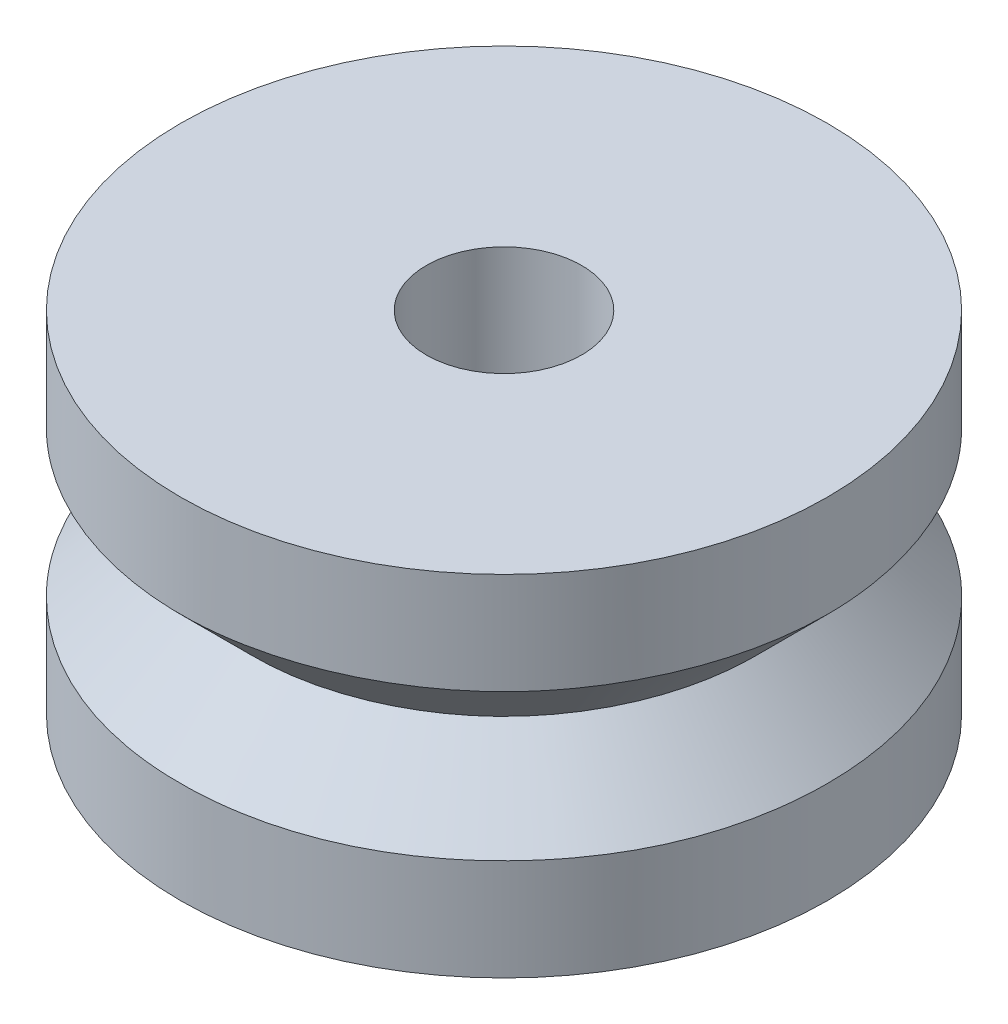
ISO-10303-21;
HEADER;
FILE_DESCRIPTION(('STEP AP214'),'2;1');
FILE_NAME('part.step','',(''),(''),'','','');
FILE_SCHEMA(('AUTOMOTIVE_DESIGN { 1 0 10303 214 1 1 1 1 }'));
ENDSEC;
DATA;
#1=APPLICATION_CONTEXT('core data for automotive mechanical design processes');
#2=APPLICATION_PROTOCOL_DEFINITION('international standard','automotive_design',2000,#1);
#3=PRODUCT_CONTEXT('',#1,'mechanical');
#4=PRODUCT('Part','Part','',(#3));
#5=PRODUCT_RELATED_PRODUCT_CATEGORY('part','',(#4));
#6=PRODUCT_DEFINITION_FORMATION('','',#4);
#7=PRODUCT_DEFINITION_CONTEXT('part definition',#1,'design');
#8=PRODUCT_DEFINITION('design','',#6,#7);
#9=PRODUCT_DEFINITION_SHAPE('','',#8);
#10=(LENGTH_UNIT() NAMED_UNIT(*) SI_UNIT(.MILLI.,.METRE.));
#11=(NAMED_UNIT(*) PLANE_ANGLE_UNIT() SI_UNIT($,.RADIAN.));
#12=(NAMED_UNIT(*) SI_UNIT($,.STERADIAN.) SOLID_ANGLE_UNIT());
#13=UNCERTAINTY_MEASURE_WITH_UNIT(LENGTH_MEASURE(1.E-05),#10,'distance_accuracy_value','');
#14=(GEOMETRIC_REPRESENTATION_CONTEXT(3) GLOBAL_UNCERTAINTY_ASSIGNED_CONTEXT((#13)) GLOBAL_UNIT_ASSIGNED_CONTEXT((#10,
#11,#12)) REPRESENTATION_CONTEXT('',''));
#15=CARTESIAN_POINT('',(0.,0.,0.));
#16=DIRECTION('',(0.,0.,1.));
#17=DIRECTION('',(1.,0.,0.));
#18=AXIS2_PLACEMENT_3D('',#15,#16,#17);
#19=CARTESIAN_POINT('',(0.,27.,0.));
#20=DIRECTION('',(0.,-1.,0.));
#21=DIRECTION('',(0.,0.,-1.));
#22=AXIS2_PLACEMENT_3D('',#19,#20,#21);
#23=CYLINDRICAL_SURFACE('',#22,25.);
#24=CARTESIAN_POINT('',(0.,19.1568542494923,-25.));
#25=CARTESIAN_POINT('',(-0.702130936899535,19.1568558298434,-25.0000052318776));
#26=CARTESIAN_POINT('',(-1.40417675735937,19.1585366600255,-24.970408594473));
#27=CARTESIAN_POINT('',(-2.80351111614704,19.1634063966516,-24.8522304637799));
#28=CARTESIAN_POINT('',(-3.50079834898091,19.1665957012991,-24.763633393173));
#29=CARTESIAN_POINT('',(-4.88618950804165,19.1729508827939,-24.527932167098));
#30=CARTESIAN_POINT('',(-5.57428251708218,19.1761167300916,-24.3807639143283));
#31=CARTESIAN_POINT('',(-6.93558198670023,19.1813176312341,-24.0289798373366));
#32=CARTESIAN_POINT('',(-7.60878945210543,19.1833527616315,-23.8243679036194));
#33=CARTESIAN_POINT('',(-8.93544454583427,19.1856827814592,-23.3591919603295));
#34=CARTESIAN_POINT('',(-9.5888959196252,19.1859780028354,-23.0986386332821));
#35=CARTESIAN_POINT('',(-10.8715385047305,19.1847452764228,-22.5234023465561));
#36=CARTESIAN_POINT('',(-11.5007293215352,19.1832172989991,-22.2087185070958));
#37=CARTESIAN_POINT('',(-12.7301945499593,19.1787846558158,-21.5275630945139));
#38=CARTESIAN_POINT('',(-13.3304761022131,19.1758803319572,-21.1611043987479));
#39=CARTESIAN_POINT('',(-14.4980858787534,19.1696456892872,-20.3788900412173));
#40=CARTESIAN_POINT('',(-15.0654142009996,19.1663153717423,-19.963134526008));
#41=CARTESIAN_POINT('',(-15.9800386060179,19.1615868679069,-19.2316931257921));
#42=CARTESIAN_POINT('',(-16.3376652545329,19.1599146313715,-18.9288200378123));
#43=CARTESIAN_POINT('',(-17.0353616485912,19.1575300222402,-18.3034384932402));
#44=CARTESIAN_POINT('',(-17.3754313639243,19.1568176512958,-17.9809300028636));
#45=CARTESIAN_POINT('',(-18.0369046671961,19.1568945557472,-17.3173200503456));
#46=CARTESIAN_POINT('',(-18.3583083165613,19.157683826201,-16.9762186493973));
#47=CARTESIAN_POINT('',(-18.9814536716341,19.1601812543355,-16.2764831154992));
#48=CARTESIAN_POINT('',(-19.2831946182794,19.1618894474668,-15.9178483066211));
#49=CARTESIAN_POINT('',(-19.8660478004041,19.1657241403355,-15.1841905018426));
#50=CARTESIAN_POINT('',(-20.1471599418195,19.16785064198,-14.8091674312268));
#51=CARTESIAN_POINT('',(-20.6878671754749,19.1720883584971,-14.0439183713327));
#52=CARTESIAN_POINT('',(-20.9474622973083,19.1741995733906,-13.6536924029649));
#53=CARTESIAN_POINT('',(-21.4442681577824,19.1780602454262,-12.8593456921132));
#54=CARTESIAN_POINT('',(-21.6814832125813,19.1798097724003,-12.4552276494125));
#55=CARTESIAN_POINT('',(-22.1328366060485,19.1826956403363,-11.6343007567399));
#56=CARTESIAN_POINT('',(-22.3469749134445,19.1838319804671,-11.2174918895711));
#57=CARTESIAN_POINT('',(-22.751496709561,19.1853399629109,-10.3725024890519));
#58=CARTESIAN_POINT('',(-22.9418802852454,19.1857116080233,-9.94432199733883));
#59=CARTESIAN_POINT('',(-23.2982911434518,19.185642354345,-9.07794249048438));
#60=CARTESIAN_POINT('',(-23.4643184784391,19.1852014573046,-8.63974349692592));
#61=CARTESIAN_POINT('',(-23.7714931315187,19.1835639611319,-7.75470988062175));
#62=CARTESIAN_POINT('',(-23.9126403586523,19.1823673592368,-7.30787522631173));
#63=CARTESIAN_POINT('',(-24.1696081552761,19.1793788556313,-6.40698451941083));
#64=CARTESIAN_POINT('',(-24.2854287574615,19.1775869546895,-5.95292847614315));
#65=CARTESIAN_POINT('',(-24.4913814238209,19.1736677954683,-5.03901350602556));
#66=CARTESIAN_POINT('',(-24.5815126642969,19.1715405264392,-4.5791543936009));
#67=CARTESIAN_POINT('',(-24.7357974990449,19.1673056416917,-3.65509835044105));
#68=CARTESIAN_POINT('',(-24.7999510657076,19.1651980259942,-3.19090141509611));
#69=CARTESIAN_POINT('',(-24.9020774437959,19.1614379082691,-2.25963636025577));
#70=CARTESIAN_POINT('',(-24.9400503883044,19.1597854039281,-1.79256825536743));
#71=CARTESIAN_POINT('',(-24.9896961959099,19.1574592852656,-0.857036627730774));
#72=CARTESIAN_POINT('',(-25.001369126997,19.1567856684135,-0.388573108592973));
#73=CARTESIAN_POINT('',(-24.9983758129561,19.1569373104829,0.548278898940192));
#74=CARTESIAN_POINT('',(-24.9837094632362,19.1577625753563,1.01666738703023));
#75=CARTESIAN_POINT('',(-24.9280918290322,19.1603141628195,1.95184937408818));
#76=CARTESIAN_POINT('',(-24.8871405598949,19.1620404848832,2.4186428739872));
#77=CARTESIAN_POINT('',(-24.7520482039908,19.1668571479147,3.581822761621));
#78=CARTESIAN_POINT('',(-24.6415535755315,19.1701980226594,4.27637591340514));
#79=CARTESIAN_POINT('',(-24.3624731866152,19.1763853477404,5.65364730381188));
#80=CARTESIAN_POINT('',(-24.1938875001582,19.1792317987064,6.3363655575093));
#81=CARTESIAN_POINT('',(-23.7998172027115,19.1835097840753,7.68520029279412));
#82=CARTESIAN_POINT('',(-23.5743326723729,19.1849413204838,8.35131679791212));
#83=CARTESIAN_POINT('',(-23.0680679669268,19.1859731329541,9.66219098383459));
#84=CARTESIAN_POINT('',(-22.7872878095908,19.1855734096045,10.3069486715035));
#85=CARTESIAN_POINT('',(-22.1723801283811,19.1830553878471,11.5706256665591));
#86=CARTESIAN_POINT('',(-21.8382442171646,19.1809368190287,12.1895408922709));
#87=CARTESIAN_POINT('',(-21.1190319582919,19.1756210824199,13.3970263566897));
#88=CARTESIAN_POINT('',(-20.7339554726304,19.1724239117073,13.9855965131817));
#89=CARTESIAN_POINT('',(-19.9155977996832,19.166068302344,15.1282115297615));
#90=CARTESIAN_POINT('',(-19.4823166392302,19.1629098636717,15.6822564090671));
#91=CARTESIAN_POINT('',(-18.570625614026,19.1582311464673,16.7518858775789));
#92=CARTESIAN_POINT('',(-18.0922159970221,19.1567108589427,17.2674706778964));
#93=CARTESIAN_POINT('',(-17.0936420126751,19.1570299772069,18.2565408653281));
#94=CARTESIAN_POINT('',(-16.5734752280618,19.1588695776297,18.7300238118699));
#95=CARTESIAN_POINT('',(-15.4951105759597,19.1639315667974,19.6314908158159));
#96=CARTESIAN_POINT('',(-14.9369124984009,19.1671539631809,20.0594746218674));
#97=CARTESIAN_POINT('',(-13.7864495088369,19.1735024507687,20.8669040965236));
#98=CARTESIAN_POINT('',(-13.194184578419,19.1766285419209,21.2463497388939));
#99=CARTESIAN_POINT('',(-11.9797951398327,19.1816996927513,21.954006106227));
#100=CARTESIAN_POINT('',(-11.3576707097267,19.1836447555169,22.2822169651246));
#101=CARTESIAN_POINT('',(-10.0879730420891,19.1857772452721,22.8850761137244));
#102=CARTESIAN_POINT('',(-9.44039931431775,19.1859646383864,23.1597233710015));
#103=CARTESIAN_POINT('',(-8.12441553387602,19.1845280451052,23.6534935591417));
#104=CARTESIAN_POINT('',(-7.45600546736482,19.1829040575065,23.8726164531211));
#105=CARTESIAN_POINT('',(-6.1031235274806,19.1783199778218,24.2537798476821));
#106=CARTESIAN_POINT('',(-5.41865161113402,19.1753598821606,24.4158201955207));
#107=CARTESIAN_POINT('',(-4.03842798473107,19.169085089993,24.6816710389335));
#108=CARTESIAN_POINT('',(-3.34267626761516,19.1657703932646,24.7854814980627));
#109=CARTESIAN_POINT('',(-2.17800767593247,19.1611395967072,24.909354663742));
#110=CARTESIAN_POINT('',(-1.71076711678537,19.1595255816862,24.9457976984101));
#111=CARTESIAN_POINT('',(-0.774944759071819,19.1573206620782,24.9923764419218));
#112=CARTESIAN_POINT('',(-0.306362959360324,19.156729758365,25.0025121282995));
#113=CARTESIAN_POINT('',(0.630620135761195,19.1570379771635,24.9964364334794));
#114=CARTESIAN_POINT('',(1.09902143175179,19.157937094842,24.9802251377433));
#115=CARTESIAN_POINT('',(2.03417236817765,19.1605974070019,24.9215092671107));
#116=CARTESIAN_POINT('',(2.50092200791712,19.1623586018463,24.879004681139));
#117=CARTESIAN_POINT('',(3.43129543063835,19.1662615144755,24.7678360669059));
#118=CARTESIAN_POINT('',(3.89491919976815,19.1684032339454,24.6991719227987));
#119=CARTESIAN_POINT('',(4.81757574043222,19.1726370723427,24.5359012661081));
#120=CARTESIAN_POINT('',(5.2766085186185,19.174729191342,24.4412947911189));
#121=CARTESIAN_POINT('',(6.18855300602679,19.1785262370562,24.2264570700544));
#122=CARTESIAN_POINT('',(6.64146579377985,19.1802312328536,24.1062304033671));
#123=CARTESIAN_POINT('',(7.53982426113186,19.1830108107928,23.8405214405115));
#124=CARTESIAN_POINT('',(7.98526992965819,19.184085392,23.6950391068964));
#125=CARTESIAN_POINT('',(8.86728396525262,19.185461580626,23.3792790211353));
#126=CARTESIAN_POINT('',(9.30385236487175,19.1857631908798,23.209001359927));
#127=CARTESIAN_POINT('',(10.1667331670792,19.1855546483281,22.8441885300576));
#128=CARTESIAN_POINT('',(10.5930455714541,19.185044495664,22.6496533656221));
#129=CARTESIAN_POINT('',(11.4340682961068,19.1832782932321,22.2369398963477));
#130=CARTESIAN_POINT('',(11.8487785740013,19.1820222407399,22.0187615051527));
#131=CARTESIAN_POINT('',(12.665284677822,19.1789335927925,21.5594521214477));
#132=CARTESIAN_POINT('',(13.0670805185512,19.1771009979983,21.3183211552479));
#133=CARTESIAN_POINT('',(13.8564999218995,19.1731272191845,20.8138615115297));
#134=CARTESIAN_POINT('',(14.2441231213978,19.1709860272653,20.550532265834));
#135=CARTESIAN_POINT('',(15.0039636458253,19.1667593727911,20.0025122617599));
#136=CARTESIAN_POINT('',(15.3761809564507,19.164673910288,19.7178214835488));
#137=CARTESIAN_POINT('',(16.1040332911254,19.1609951593696,19.1279776577579));
#138=CARTESIAN_POINT('',(16.4596684044326,19.1594018683048,18.8228247203426));
#139=CARTESIAN_POINT('',(17.1532338745745,19.1572585645608,18.1930205406034));
#140=CARTESIAN_POINT('',(17.4911642373769,19.1567085515299,17.8683693048518));
#141=CARTESIAN_POINT('',(18.1482567591414,19.157091282614,17.2005866395837));
#142=CARTESIAN_POINT('',(18.4674188366248,19.1580240331656,16.8574551298513));
#143=CARTESIAN_POINT('',(19.0859440466952,19.1607352837202,16.1538298520094));
#144=CARTESIAN_POINT('',(19.3853071883164,19.1625137833372,15.7933360918224));
#145=CARTESIAN_POINT('',(20.107791035728,19.1674127803141,14.8717880691857));
#146=CARTESIAN_POINT('',(20.5180021362102,19.1707597817943,14.3005292818486));
#147=CARTESIAN_POINT('',(21.2888207301776,19.1768915759813,13.1255452060919));
#148=CARTESIAN_POINT('',(21.6494282992965,19.1796763695454,12.5218199671779));
#149=CARTESIAN_POINT('',(22.3185319769279,19.1837932456432,11.2861297376845));
#150=CARTESIAN_POINT('',(22.6270282678407,19.1851253332616,10.6541648459596));
#151=CARTESIAN_POINT('',(23.1897021385593,19.1859500537558,9.3665048448186));
#152=CARTESIAN_POINT('',(23.4438797310248,19.1854426870603,8.71080974093316));
#153=CARTESIAN_POINT('',(23.8961477525531,19.1827329470022,7.38023739262931));
#154=CARTESIAN_POINT('',(24.0942296132203,19.1805303148855,6.70535723507685));
#155=CARTESIAN_POINT('',(24.4328461784877,19.1750957821719,5.34134003456028));
#156=CARTESIAN_POINT('',(24.5733807292463,19.1718638788233,4.65220295348826));
#157=CARTESIAN_POINT('',(24.7959085272619,19.1655289323013,3.26444269392426));
#158=CARTESIAN_POINT('',(24.8779016895295,19.1624258893148,2.56581950166201));
#159=CARTESIAN_POINT('',(24.9565444483194,19.1590444096267,1.514755674359));
#160=CARTESIAN_POINT('',(24.9753671715977,19.1581294002675,1.16384121573307));
#161=CARTESIAN_POINT('',(24.9982082641402,19.1569784075809,0.461507414153267));
#162=CARTESIAN_POINT('',(25.0022266442262,19.1567424237572,0.110088071568655));
#163=CARTESIAN_POINT('',(24.9954448724815,19.1570962920954,-0.592626057396861));
#164=CARTESIAN_POINT('',(24.9846439224262,19.1576861887424,-0.943920836048783));
#165=CARTESIAN_POINT('',(24.9482486693202,19.1594103666108,-1.64571956779044));
#166=CARTESIAN_POINT('',(24.9226543542101,19.1605446482759,-1.99622352023528));
#167=CARTESIAN_POINT('',(24.8237310412446,19.1644441918608,-3.04562819700515));
#168=CARTESIAN_POINT('',(24.7282601780289,19.1677064295227,-3.74257507062783));
#169=CARTESIAN_POINT('',(24.4789639838937,19.1740490902536,-5.125857162815));
#170=CARTESIAN_POINT('',(24.3251385190408,19.1771295129052,-5.81219235702015));
#171=CARTESIAN_POINT('',(23.9602193078996,19.1820649398664,-7.16949549644349));
#172=CARTESIAN_POINT('',(23.7491257101292,19.1839199473538,-7.84046348150976));
#173=CARTESIAN_POINT('',(23.2711589126226,19.1858540717077,-9.16226671105518));
#174=CARTESIAN_POINT('',(23.0042825280906,19.1859330871498,-9.81310080359736));
#175=CARTESIAN_POINT('',(22.4166516678555,19.1842931874558,-11.0899787964872));
#176=CARTESIAN_POINT('',(22.0958971396851,19.1825742705688,-11.7160226726931));
#177=CARTESIAN_POINT('',(21.4028196523086,19.177842889204,-12.938827508288));
#178=CARTESIAN_POINT('',(21.0304985243772,19.1748304706542,-13.5355895065399));
#179=CARTESIAN_POINT('',(20.2368691229302,19.1685245135727,-14.6956762720638));
#180=CARTESIAN_POINT('',(19.8155608832318,19.1652309752352,-15.2590010624181));
#181=CARTESIAN_POINT('',(19.075220363553,19.160707146391,-16.1664957235994));
#182=CARTESIAN_POINT('',(18.7689072042868,19.1591550546298,-16.5211263959535));
#183=CARTESIAN_POINT('',(18.1368207744852,19.1571390121258,-17.2126436625002));
#184=CARTESIAN_POINT('',(17.8110474633831,19.1566750636513,-17.5495302197009));
#185=CARTESIAN_POINT('',(17.141092150129,19.1572125161508,-18.2044616754375));
#186=CARTESIAN_POINT('',(16.796910125207,19.1582139189372,-18.522506550667));
#187=CARTESIAN_POINT('',(16.0911344996777,19.161026462597,-19.1388333188363));
#188=CARTESIAN_POINT('',(15.729536521817,19.1628378079957,-19.4371101981393));
#189=CARTESIAN_POINT('',(14.9901441730438,19.1668026584202,-20.0128735535152));
#190=CARTESIAN_POINT('',(14.6123498046838,19.1689561633922,-20.2903600328648));
#191=CARTESIAN_POINT('',(13.841796834177,19.1731817621296,-20.823646571357));
#192=CARTESIAN_POINT('',(13.449038504406,19.1752538573755,-21.0794470249581));
#193=CARTESIAN_POINT('',(12.4497615144597,19.1799121805151,-21.6909508250407));
#194=CARTESIAN_POINT('',(11.8345810141121,19.1822372007864,-22.0326304735487));
#195=CARTESIAN_POINT('',(10.5776312158809,19.185223823765,-22.6629257147292));
#196=CARTESIAN_POINT('',(9.93586021430764,19.18588531972,-22.9515379008347));
#197=CARTESIAN_POINT('',(8.63096921936534,19.1853586144404,-23.4733783145198));
#198=CARTESIAN_POINT('',(7.96787337256021,19.1841724378245,-23.7066668412845));
#199=CARTESIAN_POINT('',(6.62462581635192,19.1802993228938,-24.1165384818533));
#200=CARTESIAN_POINT('',(5.94447856884996,19.1776127733517,-24.2931362665528));
#201=CARTESIAN_POINT('',(4.39492853396474,19.1707987548876,-24.6264832020432));
#202=CARTESIAN_POINT('',(3.52186142553552,19.1664783946862,-24.7664317795229));
#203=CARTESIAN_POINT('',(1.76581797342588,19.1595051545625,-24.9531865473901));
#204=CARTESIAN_POINT('',(0.882841702540565,19.1568522623989,-24.9999934215693));
#205=CARTESIAN_POINT('',(0.,19.1568542494923,-25.));
#206=B_SPLINE_CURVE_WITH_KNOTS('',3,(#24,#25,#26,#27,#28,#29,#30,#31,#32,#33,#34,#35,#36,#37,
#38,#39,#40,#41,#42,#43,#44,#45,#46,#47,#48,#49,#50,#51,#52,#53,#54,#55,#56,#57,#58,#59,#60,#61,
#62,#63,#64,#65,#66,#67,#68,#69,#70,#71,#72,#73,#74,#75,#76,#77,#78,#79,#80,#81,#82,#83,#84,#85,
#86,#87,#88,#89,#90,#91,#92,#93,#94,#95,#96,#97,#98,#99,#100,#101,#102,#103,#104,#105,#106,#107,
#108,#109,#110,#111,#112,#113,#114,#115,#116,#117,#118,#119,#120,#121,#122,#123,#124,#125,#126,
#127,#128,#129,#130,#131,#132,#133,#134,#135,#136,#137,#138,#139,#140,#141,#142,#143,#144,#145,
#146,#147,#148,#149,#150,#151,#152,#153,#154,#155,#156,#157,#158,#159,#160,#161,#162,#163,#164,
#165,#166,#167,#168,#169,#170,#171,#172,#173,#174,#175,#176,#177,#178,#179,#180,#181,#182,#183,
#184,#185,#186,#187,#188,#189,#190,#191,#192,#193,#194,#195,#196,#197,#198,#199,#200,#201,#202,
#203,#204,#205),.UNSPECIFIED.,.T.,.F.,(4,2,2,2,2,2,2,2,2,2,2,2,2,2,2,2,2,2,2,2,2,2,2,2,2,2,2,2,
2,2,2,2,2,2,2,2,2,2,2,2,2,2,2,2,2,2,2,2,2,2,2,2,2,2,2,2,2,2,2,2,2,2,2,2,2,2,2,2,2,2,2,2,2,2,2,2,
2,2,2,2,2,2,2,2,2,2,2,2,2,2,4),(0.,2.10562351142162,4.21180317093632,6.32029409143729,
8.42864224400092,10.5365881455447,12.6445683107145,14.7520251025497,16.8594756292475,
18.264748774605,19.670024337927,21.0752952764912,22.4806204322709,23.8859519957067,
25.2912816262881,26.6963396724372,28.1013996226138,29.5064544288499,30.9115062084466,
32.3165631246371,33.7216182269718,35.1267183756198,36.5318200176212,37.9369145170749,
39.3420053841088,40.7471018306919,42.1521974568867,44.2594337375869,46.3666673339742,
48.4738979434908,50.581127875765,52.6886893840903,54.7962566022196,56.9038226471987,
59.0113771226827,61.119053689961,63.2267419001603,65.3344312495403,67.4421150890402,
69.5498395496113,71.657565410301,73.7652969108629,75.8730297306125,77.2783434302095,
78.6836583299167,80.0889686712127,81.4942796044527,82.8995967610911,84.3049118812376,
85.7099760238203,87.1150422497208,88.5201033226176,89.9251641507619,91.330230111025,
92.7352944607001,94.1403947846961,95.5454964132497,96.9505904776072,98.3556840683505,
99.7607837585635,101.165882807634,103.273111907741,105.380337794783,107.48755630594,
109.594774325986,111.702314041651,113.809859391376,115.917407800793,116.97141134128,
118.025414111294,119.079473656083,120.133534060129,122.241196320999,124.348863419332,
126.456525051742,128.564307049344,130.672091099541,132.779800315587,134.887508076629,
136.29265743381,137.697809720263,139.102963744807,140.50847279688,141.913981627438,
143.319464886963,145.427915382134,147.536501178148,149.642778080276,151.748509462536,
154.39608670971,157.043644519855),.UNSPECIFIED.);
#207=CARTESIAN_POINT('',(0.,19.1568542494923,-25.));
#208=VERTEX_POINT('',#207);
#209=EDGE_CURVE('E74',#208,#208,#206,.T.);
#210=ORIENTED_EDGE('',*,*,#209,.T.);
#211=EDGE_LOOP('',(#210));
#212=FACE_BOUND('',#211,.T.);
#213=CARTESIAN_POINT('',(0.,27.,0.));
#214=DIRECTION('',(0.,1.,0.));
#215=DIRECTION('',(0.,0.,1.));
#216=AXIS2_PLACEMENT_3D('',#213,#214,#215);
#217=CIRCLE('',#216,25.);
#218=CARTESIAN_POINT('',(0.,27.,25.));
#219=VERTEX_POINT('',#218);
#220=EDGE_CURVE('E82',#219,#219,#217,.T.);
#221=ORIENTED_EDGE('',*,*,#220,.F.);
#222=EDGE_LOOP('',(#221));
#223=FACE_BOUND('',#222,.T.);
#224=ADVANCED_FACE('F69',(#212,#223),#23,.T.);
#225=CARTESIAN_POINT('',(0.,7.84314575050757,-25.));
#226=CARTESIAN_POINT('',(0.70213039242485,7.84314417022639,-25.0000052319263));
#227=CARTESIAN_POINT('',(1.40417566775638,7.84146334273437,-24.9704086404435));
#228=CARTESIAN_POINT('',(2.80350894705962,7.83659361243468,-24.8522306930166));
#229=CARTESIAN_POINT('',(3.50079564554777,7.8334043114259,-24.7636337598649));
#230=CARTESIAN_POINT('',(4.88618575633086,7.82704913504825,-24.5279328987521));
#231=CARTESIAN_POINT('',(5.574278251494,7.82388328922656,-24.3807648737592));
#232=CARTESIAN_POINT('',(6.93557672837632,7.81868238715779,-24.0289813390383));
#233=CARTESIAN_POINT('',(7.60878371490755,7.8166472543594,-23.8243697197575));
#234=CARTESIAN_POINT('',(8.93543841232743,7.81431722496384,-23.3591943064796));
#235=CARTESIAN_POINT('',(9.58888985342093,7.81402199777339,-23.0986411514867));
#236=CARTESIAN_POINT('',(10.8715325876239,7.81525471310678,-22.5234052025885));
#237=CARTESIAN_POINT('',(11.5007234862121,7.81678268526632,-22.2087215288749));
#238=CARTESIAN_POINT('',(12.7301888937464,7.82121532006032,-21.5275664393127));
#239=CARTESIAN_POINT('',(13.3304705432386,7.82411964079732,-21.1611079006684));
#240=CARTESIAN_POINT('',(14.4980805270108,7.83035428100966,-20.3788938486256));
#241=CARTESIAN_POINT('',(15.065408959254,7.83368459921851,-19.9631384817878));
#242=CARTESIAN_POINT('',(15.9800335570096,7.83841310797721,-19.2316973211209));
#243=CARTESIAN_POINT('',(16.3376602849614,7.84008534749999,-18.9288243270983));
#244=CARTESIAN_POINT('',(17.0353568430645,7.84246996590683,-18.3034429658329));
#245=CARTESIAN_POINT('',(17.3754266430051,7.8431823431393,-17.9809345648051));
#246=CARTESIAN_POINT('',(18.036900120393,7.84310545100749,-17.3173247860777));
#247=CARTESIAN_POINT('',(18.358303859267,7.84231618658515,-16.9762234695712));
#248=CARTESIAN_POINT('',(18.9814493977777,7.83981876735569,-16.2764880996115));
#249=CARTESIAN_POINT('',(19.2831904383644,7.83811057709829,-15.9178533702404));
#250=CARTESIAN_POINT('',(19.8660438127054,7.83427588796742,-15.1841957190864));
#251=CARTESIAN_POINT('',(20.1471560523954,7.83214938718669,-14.809172722588));
#252=CARTESIAN_POINT('',(20.6878634866234,7.82791167053679,-14.0439238053062));
#253=CARTESIAN_POINT('',(20.9474587107545,7.82580045464661,-13.653697905433));
#254=CARTESIAN_POINT('',(21.4442647796237,7.82193977923945,-12.8593513255296));
#255=CARTESIAN_POINT('',(21.681479940509,7.82019024989091,-12.4552333452771));
#256=CARTESIAN_POINT('',(22.1328335494969,7.81730437626981,-11.6343065714481));
#257=CARTESIAN_POINT('',(22.3469719663274,7.81616803282819,-11.217497760675));
#258=CARTESIAN_POINT('',(22.7514939843185,7.81466004330872,-10.3725084667081));
#259=CARTESIAN_POINT('',(22.9418776724428,7.81428839443133,-9.94432802515187));
#260=CARTESIAN_POINT('',(23.2982887581908,7.8143576406124,-9.07794861218334));
#261=CARTESIAN_POINT('',(23.464316208278,7.8147985339206,-8.6397496623534));
#262=CARTESIAN_POINT('',(23.7714910938395,7.81643602314797,-7.75471612696811));
#263=CARTESIAN_POINT('',(23.9126384383552,7.81763262182983,-7.30788150984842));
#264=CARTESIAN_POINT('',(24.1696064716512,7.82062112000923,-6.40699087067957));
#265=CARTESIAN_POINT('',(24.2854271931269,7.82241301873826,-5.95293485795367));
#266=CARTESIAN_POINT('',(24.4913800996226,7.82633217496711,-5.0390199420899));
#267=CARTESIAN_POINT('',(24.5815114609396,7.82845944321681,-4.57916085337596));
#268=CARTESIAN_POINT('',(24.7357965385121,7.83269432833497,-3.65510485081692));
#269=CARTESIAN_POINT('',(24.7999502271579,7.83480194518255,-3.19090793236202));
#270=CARTESIAN_POINT('',(24.9020768499711,7.83856206721314,-2.25964290442185));
#271=CARTESIAN_POINT('',(24.9400499172209,7.84021457470954,-1.79257480954363));
#272=CARTESIAN_POINT('',(24.9896959706797,7.84254070308045,-0.857043195013012));
#273=CARTESIAN_POINT('',(25.0013690248787,7.84321432648554,-0.38857967897116));
#274=CARTESIAN_POINT('',(24.9983759570436,7.84306269701028,0.548272329306632));
#275=CARTESIAN_POINT('',(24.9837097304182,7.84223743817798,1.01666082123727));
#276=CARTESIAN_POINT('',(24.9280923419853,7.83968585970316,1.95184282288032));
#277=CARTESIAN_POINT('',(24.8871411955249,7.83795954058673,2.41863633352383));
#278=CARTESIAN_POINT('',(24.7520491452916,7.83314288233017,3.58181625683012));
#279=CARTESIAN_POINT('',(24.6415546993275,7.82980200811798,4.27636943783302));
#280=CARTESIAN_POINT('',(24.3624746722647,7.82361468037769,5.65364090192937));
#281=CARTESIAN_POINT('',(24.1938891651651,7.82076822621981,6.33635920009746));
#282=CARTESIAN_POINT('',(23.7998192220435,7.81649023235974,7.68519403926383));
#283=CARTESIAN_POINT('',(23.5743348666729,7.815058690652,8.35131060379281));
#284=CARTESIAN_POINT('',(23.0680705055185,7.81402686708851,9.66218492306599));
#285=CARTESIAN_POINT('',(22.7872905175064,7.81442658464419,10.3069426846747));
#286=CARTESIAN_POINT('',(22.1723831680462,7.81694459592918,11.5706198417767));
#287=CARTESIAN_POINT('',(21.8382474192412,7.81906316006977,12.1895351555907));
#288=CARTESIAN_POINT('',(21.1190354771697,7.82437889020802,13.3970208095591));
#289=CARTESIAN_POINT('',(20.7339591458976,7.82757605912782,13.9855910674982));
#290=CARTESIAN_POINT('',(19.9156017726196,7.83393166858292,15.128206299588));
#291=CARTESIAN_POINT('',(19.4823207574456,7.83709010913977,15.6822512929561));
#292=CARTESIAN_POINT('',(18.5706300126659,7.84176883743483,16.7518810013957));
#293=CARTESIAN_POINT('',(18.0922205308076,7.8432891341656,17.2674659275785));
#294=CARTESIAN_POINT('',(17.0936468055787,7.84297003318514,18.2565363777353));
#295=CARTESIAN_POINT('',(16.5734801449339,7.8411304408396,18.7300194611342));
#296=CARTESIAN_POINT('',(15.4951157287894,7.83606846121212,19.6314867487092));
#297=CARTESIAN_POINT('',(14.9369177632196,7.83284606629161,20.0594707015325));
#298=CARTESIAN_POINT('',(13.7864549848669,7.82649757795134,20.8669004786063));
#299=CARTESIAN_POINT('',(13.1941901536712,7.82337148458363,21.2463462766221));
#300=CARTESIAN_POINT('',(11.9798009000544,7.81830032666033,21.954002963019));
#301=CARTESIAN_POINT('',(11.3576765556959,7.81635525901733,22.2822139853349));
#302=CARTESIAN_POINT('',(10.0879790461486,7.8142227585702,22.8850734670627));
#303=CARTESIAN_POINT('',(9.44040539074728,7.81403535963951,23.1597208941077));
#304=CARTESIAN_POINT('',(8.12442174048658,7.81547194197474,23.6534914273069));
#305=CARTESIAN_POINT('',(7.45601173178645,7.81709592444391,23.8726144965775));
#306=CARTESIAN_POINT('',(6.10312989255995,7.82167999614132,24.2537782459888));
#307=CARTESIAN_POINT('',(5.41865801906003,7.82464008894472,24.4158187733862));
#308=CARTESIAN_POINT('',(4.03843446308548,7.83091487932572,24.6816699789317));
#309=CARTESIAN_POINT('',(3.34268277355113,7.83422957712528,24.7854806206337));
#310=CARTESIAN_POINT('',(2.17801421495796,7.83886037931985,24.9093540919818));
#311=CARTESIAN_POINT('',(1.71077366561228,7.84047439762325,24.9457972492904));
#312=CARTESIAN_POINT('',(0.774951320597594,7.84267932728015,24.9923762384617));
#313=CARTESIAN_POINT('',(0.306369523783535,7.84327023775994,25.0025120478588));
#314=CARTESIAN_POINT('',(-0.630613572475471,7.84296203150768,24.9964365990553));
#315=CARTESIAN_POINT('',(-1.09901487250097,7.84206291960882,24.9802254263168));
#316=CARTESIAN_POINT('',(-2.03416582389888,7.8394026160552,24.9215098012705));
#317=CARTESIAN_POINT('',(-2.5009154745755,7.83764142403732,24.8790053378875));
#318=CARTESIAN_POINT('',(-3.4312889260442,7.83373851501022,24.7678369680366));
#319=CARTESIAN_POINT('',(-3.89491271298428,7.83159679631588,24.6991729457224));
#320=CARTESIAN_POINT('',(-4.81756929608187,7.82736295763811,24.5359025314384));
#321=CARTESIAN_POINT('',(-5.27660209889132,7.82527083758281,24.4412961770625));
#322=CARTESIAN_POINT('',(-6.18854664236209,7.82147378839218,24.2264586956237));
#323=CARTESIAN_POINT('',(-6.64145946155215,7.81976879017457,24.1062321479444));
#324=CARTESIAN_POINT('',(-7.5398179984148,7.81698920647757,23.84052342116));
#325=CARTESIAN_POINT('',(-7.98526370501482,7.8159146219329,23.6950412046084));
#326=CARTESIAN_POINT('',(-8.86727782328136,7.81453842619575,23.3792813506559));
#327=CARTESIAN_POINT('',(-9.30384626749887,7.81423681216846,23.2090038041928));
#328=CARTESIAN_POINT('',(-10.1667271652849,7.81444534722492,22.8441912011331));
#329=CARTESIAN_POINT('',(-10.59303962064,7.81495549616726,22.6496561487622));
#330=CARTESIAN_POINT('',(-11.4340624534764,7.81672169169296,22.2369429005807));
#331=CARTESIAN_POINT('',(-11.8487727885744,7.81797774100078,22.0187646184139));
#332=CARTESIAN_POINT('',(-12.6652790128374,7.82106638359832,21.5594554493873));
#333=CARTESIAN_POINT('',(-13.0670749168055,7.82289897622716,21.3183245888379));
#334=CARTESIAN_POINT('',(-13.856494452567,7.82687275215835,20.8138651526498));
#335=CARTESIAN_POINT('',(-14.2441177212363,7.82901394336053,20.5505360088284));
#336=CARTESIAN_POINT('',(-15.0039583896167,7.83324059835322,20.002516204461));
#337=CARTESIAN_POINT('',(-15.376175775024,7.835326062092,19.7178255240821));
#338=CARTESIAN_POINT('',(-16.1040282646422,7.8390048174697,19.1279818896019));
#339=CARTESIAN_POINT('',(-16.4596634581108,7.84059811175809,18.8228290456646));
#340=CARTESIAN_POINT('',(-17.1532290937039,7.84274142546769,18.1930250482306));
#341=CARTESIAN_POINT('',(-17.4911595417962,7.84329144524055,17.8683739013062));
#342=CARTESIAN_POINT('',(-18.1482522390079,7.84290872643283,17.2005914087526));
#343=CARTESIAN_POINT('',(-18.467414406649,7.84197598141565,16.8574599829079));
#344=CARTESIAN_POINT('',(-19.0859398015957,7.83926473906564,16.1538348676436));
#345=CARTESIAN_POINT('',(-19.3853030379354,7.83748624211871,15.7933411861465));
#346=CARTESIAN_POINT('',(-20.1077871276104,7.83258724923207,14.871793353265));
#347=CARTESIAN_POINT('',(-20.5179983783034,7.82924024788077,14.3005346735947));
#348=CARTESIAN_POINT('',(-21.2888172811985,7.82310845038102,13.1255508001293));
#349=CARTESIAN_POINT('',(-21.6494250090337,7.82032365337535,12.5218256558395));
#350=CARTESIAN_POINT('',(-22.3185290114979,7.81620676842619,11.2861356018854));
#351=CARTESIAN_POINT('',(-22.627025468527,7.81487467539786,10.6541707910755));
#352=CARTESIAN_POINT('',(-23.1896996776928,7.81404994372678,9.36651093747053));
#353=CARTESIAN_POINT('',(-23.4438774424892,7.81455730465533,8.71081590020616));
#354=CARTESIAN_POINT('',(-23.896145813752,7.81726703448574,7.38024367021927));
#355=CARTESIAN_POINT('',(-24.0942278518091,7.81946966214233,6.70536356435556));
#356=CARTESIAN_POINT('',(-24.4328447755409,7.82490418878969,5.3413464520908));
#357=CARTESIAN_POINT('',(-24.5733795073739,7.82813609053197,4.65220940758174));
#358=CARTESIAN_POINT('',(-24.7959076699695,7.83447103826761,3.26444920577739));
#359=CARTESIAN_POINT('',(-24.8779010157423,7.83757408407388,2.56582603471173));
#360=CARTESIAN_POINT('',(-24.9565440505694,7.84095557179288,1.51476222756221));
#361=CARTESIAN_POINT('',(-24.9753668660002,7.84187058446311,1.16384777371454));
#362=CARTESIAN_POINT('',(-24.9982081429661,7.8430215857941,0.461513977798983));
#363=CARTESIAN_POINT('',(-25.0022266153233,7.84325757495122,0.110094636100351));
#364=CARTESIAN_POINT('',(-24.995445028073,7.84290371625706,-0.592619495041212));
#365=CARTESIAN_POINT('',(-24.9846441702388,7.84231382392057,-0.943914276755353));
#366=CARTESIAN_POINT('',(-24.9482491013483,7.84058965311486,-1.64571301850558));
#367=CARTESIAN_POINT('',(-24.9226548782325,7.83945537420186,-1.99621697789677));
#368=CARTESIAN_POINT('',(-24.8237318406681,7.83555583694523,-3.04562168131237));
#369=CARTESIAN_POINT('',(-24.728261160318,7.8322936009333,-3.74256858043931));
#370=CARTESIAN_POINT('',(-24.4789653290599,7.82595093947099,-5.12585073891703));
#371=CARTESIAN_POINT('',(-24.3251400442183,7.82287051443791,-5.8121859739085));
#372=CARTESIAN_POINT('',(-23.9602211889992,7.81793508019655,-7.16948920990883));
#373=CARTESIAN_POINT('',(-23.7491277671398,7.81608006781035,-7.84045725076577));
#374=CARTESIAN_POINT('',(-23.2711613163556,7.81414593273562,-9.16226060580847));
#375=CARTESIAN_POINT('',(-23.0042851026943,7.81406691146948,-9.81309476807962));
#376=CARTESIAN_POINT('',(-22.4166545777383,7.81570680025255,-11.0899729145942));
#377=CARTESIAN_POINT('',(-22.0959002139768,7.81742571205259,-11.7160168746961));
#378=CARTESIAN_POINT('',(-21.4028230477446,7.82215708555149,-12.9388218916977));
#379=CARTESIAN_POINT('',(-21.0305020765442,7.82516950132248,-13.5355839874572));
#380=CARTESIAN_POINT('',(-20.236872979821,7.83147545681643,-14.6956709608707));
#381=CARTESIAN_POINT('',(-19.8155648881144,7.83476899634533,-15.2589958616064));
#382=CARTESIAN_POINT('',(-19.0752246068317,7.83929283102768,-16.1664907168537));
#383=CARTESIAN_POINT('',(-18.7689115406995,7.84084492615147,-16.5211214695469));
#384=CARTESIAN_POINT('',(-18.1368252925154,7.8428609789198,-17.2126389018855));
#385=CARTESIAN_POINT('',(-17.8110520698972,7.84332493429594,-17.5495255445391));
#386=CARTESIAN_POINT('',(-17.1410969286639,7.84278749398222,-18.2044571760257));
#387=CARTESIAN_POINT('',(-16.7969149872793,7.84178609647985,-18.5225021415527));
#388=CARTESIAN_POINT('',(-16.0911395238631,7.83897356065373,-19.1388290947004));
#389=CARTESIAN_POINT('',(-15.7295416245876,7.83716221780454,-19.4371060686978));
#390=CARTESIAN_POINT('',(-14.9901494275482,7.83319737042897,-20.0128696177502));
#391=CARTESIAN_POINT('',(-14.6123551323365,7.83104386595651,-20.2903561960813));
#392=CARTESIAN_POINT('',(-13.841802302446,7.82681826645534,-20.8236429365062));
#393=CARTESIAN_POINT('',(-13.4490440401425,7.82474616994623,-21.0794434930575));
#394=CARTESIAN_POINT('',(-12.4497672121074,7.82008784201232,-21.6909475547726));
#395=CARTESIAN_POINT('',(-11.8345868025637,7.81776281738957,-22.0326273643053));
#396=CARTESIAN_POINT('',(-10.5776371721881,7.81477618431504,-22.6629229346598));
#397=CARTESIAN_POINT('',(-9.93586624766947,7.81411468261524,-22.9515352889226));
#398=CARTESIAN_POINT('',(-8.63097539053984,7.81464137668229,-23.4733760454402));
#399=CARTESIAN_POINT('',(-7.96787960445035,7.81582754783507,-23.7066647467278));
#400=CARTESIAN_POINT('',(-6.62463215464142,7.81970065371926,-24.1165367408155));
#401=CARTESIAN_POINT('',(-5.94448495281784,7.8223871996783,-24.2931347044799));
#402=CARTESIAN_POINT('',(-4.39493393401234,7.82920121874392,-24.6264822775252));
#403=CARTESIAN_POINT('',(-3.52186576657984,7.8335215854568,-24.7664312012985));
#404=CARTESIAN_POINT('',(-1.76582016091633,7.84049483872123,-24.9531864313047));
#405=CARTESIAN_POINT('',(-0.882842795498154,7.84314773751719,-24.9999934214948));
#406=CARTESIAN_POINT('',(0.,7.84314575050757,-25.));
#407=B_SPLINE_CURVE_WITH_KNOTS('',3,(#225,#226,#227,#228,#229,#230,#231,#232,#233,#234,#235,
#236,#237,#238,#239,#240,#241,#242,#243,#244,#245,#246,#247,#248,#249,#250,#251,#252,#253,#254,
#255,#256,#257,#258,#259,#260,#261,#262,#263,#264,#265,#266,#267,#268,#269,#270,#271,#272,#273,
#274,#275,#276,#277,#278,#279,#280,#281,#282,#283,#284,#285,#286,#287,#288,#289,#290,#291,#292,
#293,#294,#295,#296,#297,#298,#299,#300,#301,#302,#303,#304,#305,#306,#307,#308,#309,#310,#311,
#312,#313,#314,#315,#316,#317,#318,#319,#320,#321,#322,#323,#324,#325,#326,#327,#328,#329,#330,
#331,#332,#333,#334,#335,#336,#337,#338,#339,#340,#341,#342,#343,#344,#345,#346,#347,#348,#349,
#350,#351,#352,#353,#354,#355,#356,#357,#358,#359,#360,#361,#362,#363,#364,#365,#366,#367,#368,
#369,#370,#371,#372,#373,#374,#375,#376,#377,#378,#379,#380,#381,#382,#383,#384,#385,#386,#387,
#388,#389,#390,#391,#392,#393,#394,#395,#396,#397,#398,#399,#400,#401,#402,#403,#404,#405,#406),
.UNSPECIFIED.,.T.,.F.,(4,2,2,2,2,2,2,2,2,2,2,2,2,2,2,2,2,2,2,2,2,2,2,2,2,2,2,2,2,2,2,2,2,2,2,2,
2,2,2,2,2,2,2,2,2,2,2,2,2,2,2,2,2,2,2,2,2,2,2,2,2,2,2,2,2,2,2,2,2,2,2,2,2,2,2,2,2,2,2,2,2,2,2,2,
2,2,2,2,2,2,4),(0.,2.1056218783055,4.2117999011791,6.32028917705189,8.42863568699165,
10.5365815845825,12.6445617468312,14.7520185419637,16.8594690717301,18.2647422168146,
19.670017779894,21.0752887181991,22.4806138728697,23.8859454352099,25.2912750647036,
26.6963331104257,28.1013930601669,29.5064478659687,30.9114996452216,32.3165565610682,
33.7216116630477,35.1267118116077,36.5318134535313,37.9369079529307,39.3419988199131,
40.7470952664167,42.1521908925218,44.2594271737626,46.3666607707201,48.4738913807912,
50.5811213136095,52.6886828229949,54.7962500421872,56.9038160882602,59.0113705648342,
61.1190471333713,63.2267353448366,65.334424695497,67.4421085362737,69.5498329958361,
71.6575588555041,73.7652903550415,75.8730231738009,77.2783368727332,78.6836517717622,
80.0889621123534,81.4942730448828,82.8995902008357,84.3049053203073,85.7099694624722,
87.1150356879436,88.5200967604115,89.9251575881149,91.3302235479375,92.7352878971613,
94.1403882210565,95.5454898495191,96.9505839138077,98.3556775044775,99.7607771945892,
101.16587624355,103.273105344132,105.380331231676,107.487549743338,109.594767763878,
111.702307480577,113.80985283134,115.917401241811,116.97140478282,118.025407553354,
119.079467098797,120.133527503498,122.241189765686,124.348856865342,126.45651849907,
128.564300495743,130.672084544996,132.779793760299,134.887501520638,136.292650877621,
137.697803163856,139.102957188145,140.508466239093,141.913975068563,143.319458327061,
145.427908818693,147.536494610863,149.642771514727,151.748502899843,154.396083429013,
157.04364451647),.UNSPECIFIED.);
#408=CARTESIAN_POINT('',(0.,7.84314575050757,-25.));
#409=VERTEX_POINT('',#408);
#410=EDGE_CURVE('E95',#409,#409,#407,.T.);
#411=ORIENTED_EDGE('',*,*,#410,.T.);
#412=EDGE_LOOP('',(#411));
#413=FACE_BOUND('',#412,.T.);
#414=CARTESIAN_POINT('',(0.,0.,0.));
#415=DIRECTION('',(0.,1.,0.));
#416=DIRECTION('',(0.,0.,1.));
#417=AXIS2_PLACEMENT_3D('',#414,#415,#416);
#418=CIRCLE('',#417,25.);
#419=CARTESIAN_POINT('',(0.,0.,25.));
#420=VERTEX_POINT('',#419);
#421=EDGE_CURVE('E91',#420,#420,#418,.T.);
#422=ORIENTED_EDGE('',*,*,#421,.T.);
#423=EDGE_LOOP('',(#422));
#424=FACE_BOUND('',#423,.T.);
#425=ADVANCED_FACE('F71',(#413,#424),#23,.T.);
#426=CARTESIAN_POINT('',(0.,27.,0.));
#427=DIRECTION('',(0.,-1.,0.));
#428=DIRECTION('',(0.,0.,-1.));
#429=AXIS2_PLACEMENT_3D('',#426,#427,#428);
#430=CYLINDRICAL_SURFACE('',#429,6.);
#431=CARTESIAN_POINT('',(0.,27.,0.));
#432=DIRECTION('',(0.,1.,0.));
#433=DIRECTION('',(0.,0.,1.));
#434=AXIS2_PLACEMENT_3D('',#431,#432,#433);
#435=CIRCLE('',#434,6.);
#436=CARTESIAN_POINT('',(0.,27.,6.));
#437=VERTEX_POINT('',#436);
#438=EDGE_CURVE('E12',#437,#437,#435,.T.);
#439=ORIENTED_EDGE('',*,*,#438,.T.);
#440=EDGE_LOOP('',(#439));
#441=FACE_BOUND('',#440,.T.);
#442=CARTESIAN_POINT('',(0.,0.,0.));
#443=DIRECTION('',(0.,1.,0.));
#444=DIRECTION('',(0.,0.,1.));
#445=AXIS2_PLACEMENT_3D('',#442,#443,#444);
#446=CIRCLE('',#445,6.);
#447=CARTESIAN_POINT('',(0.,0.,6.));
#448=VERTEX_POINT('',#447);
#449=EDGE_CURVE('E87',#448,#448,#446,.T.);
#450=ORIENTED_EDGE('',*,*,#449,.F.);
#451=EDGE_LOOP('',(#450));
#452=FACE_BOUND('',#451,.T.);
#453=ADVANCED_FACE('F122',(#441,#452),#430,.F.);
#454=CARTESIAN_POINT('',(0.,27.,0.));
#455=DIRECTION('',(0.,1.,0.));
#456=DIRECTION('',(0.,0.,1.));
#457=AXIS2_PLACEMENT_3D('',#454,#455,#456);
#458=PLANE('',#457);
#459=ORIENTED_EDGE('',*,*,#220,.T.);
#460=EDGE_LOOP('',(#459));
#461=FACE_BOUND('',#460,.T.);
#462=ORIENTED_EDGE('',*,*,#438,.F.);
#463=EDGE_LOOP('',(#462));
#464=FACE_BOUND('',#463,.T.);
#465=ADVANCED_FACE('F113',(#461,#464),#458,.T.);
#466=CARTESIAN_POINT('',(0.,0.,0.));
#467=DIRECTION('',(0.,1.,0.));
#468=DIRECTION('',(0.,0.,1.));
#469=AXIS2_PLACEMENT_3D('',#466,#467,#468);
#470=PLANE('',#469);
#471=ORIENTED_EDGE('',*,*,#421,.F.);
#472=EDGE_LOOP('',(#471));
#473=FACE_BOUND('',#472,.T.);
#474=ORIENTED_EDGE('',*,*,#449,.T.);
#475=EDGE_LOOP('',(#474));
#476=FACE_BOUND('',#475,.T.);
#477=ADVANCED_FACE('F121',(#473,#476),#470,.F.);
#478=CARTESIAN_POINT('',(19.3431457505076,13.5,0.));
#479=CARTESIAN_POINT('',(19.3431457504839,13.5,-5.05250462477782));
#480=CARTESIAN_POINT('',(15.1575138711927,13.5,-15.1575138727426));
#481=CARTESIAN_POINT('',(-6.31849900092213E-09,13.5,-21.4359616922363));
#482=CARTESIAN_POINT('',(-15.1575138784191,13.5,-15.1575138655323));
#483=CARTESIAN_POINT('',(-21.4359616901007,13.5,1.18873864033287E-08));
#484=CARTESIAN_POINT('',(-15.1575138648495,13.5,15.1575138794559));
#485=CARTESIAN_POINT('',(5.84034925456278E-09,13.5,21.4359616862392));
#486=CARTESIAN_POINT('',(15.1575138715072,13.5,15.1575138727945));
#487=CARTESIAN_POINT('',(19.3431457505312,13.5,5.05250462456957));
#488=CARTESIAN_POINT('',(19.3431457505076,13.5,0.));
#489=CARTESIAN_POINT('',(25.3232753066816,19.4801295561739,0.));
#490=CARTESIAN_POINT('',(25.3232753066507,19.4801295561739,-6.61453763786965));
#491=CARTESIAN_POINT('',(19.843612909497,19.4801295561743,-19.8436129115261));
#492=CARTESIAN_POINT('',(-8.27200439222631E-09,19.4801295561738,-28.0631065079858));
#493=CARTESIAN_POINT('',(-19.8436129189573,19.4801295561743,-19.8436129020856));
#494=CARTESIAN_POINT('',(-28.0631065051886,19.4801295561728,1.55610104879758E-08));
#495=CARTESIAN_POINT('',(-19.8436129011976,19.4801295561782,19.8436129203198));
#496=CARTESIAN_POINT('',(7.64722877036328E-09,19.4801295561728,28.063106500133));
#497=CARTESIAN_POINT('',(19.8436129099085,19.4801295561745,19.8436129115944));
#498=CARTESIAN_POINT('',(25.3232753067125,19.480129556174,6.61453763759701));
#499=CARTESIAN_POINT('',(25.3232753066816,19.4801295561739,0.));
#500=B_SPLINE_SURFACE_WITH_KNOTS('',1,3,((#478,#479,#480,#481,#482,#483,#484,#485,#486,#487,
#488),(#489,#490,#491,#492,#493,#494,#495,#496,#497,#498,#499)),.UNSPECIFIED.,.F.,.T.,.F.,(2,2),
(4,1,1,1,1,1,1,1,4),(0.,1.),(0.,0.125000000018072,0.250000000000004,0.375000000142748,
0.50000000000001,0.625000000161444,0.749999999999996,0.87499999998708,1.),.UNSPECIFIED.);
#501=CARTESIAN_POINT('',(19.3431457505076,13.5,0.));
#502=CARTESIAN_POINT('',(19.3431457504839,13.5,-5.05250462477782));
#503=CARTESIAN_POINT('',(15.1575138711927,13.5,-15.1575138727426));
#504=CARTESIAN_POINT('',(-6.31849900092213E-09,13.5,-21.4359616922363));
#505=CARTESIAN_POINT('',(-15.1575138784191,13.5,-15.1575138655323));
#506=CARTESIAN_POINT('',(-21.4359616901007,13.5,1.18873877890746E-08));
#507=CARTESIAN_POINT('',(-15.1575138648495,13.5,15.1575138794559));
#508=CARTESIAN_POINT('',(5.84034795352018E-09,13.5,21.4359616862392));
#509=CARTESIAN_POINT('',(15.1575138715072,13.5,15.1575138727945));
#510=CARTESIAN_POINT('',(19.3431457505312,13.5,5.05250462456957));
#511=CARTESIAN_POINT('',(19.3431457505076,13.5,0.));
#512=B_SPLINE_CURVE_WITH_KNOTS('',3,(#501,#502,#503,#504,#505,#506,#507,#508,#509,#510,#511),
.UNSPECIFIED.,.T.,.F.,(4,1,1,1,1,1,1,1,4),(0.,0.125000000018072,0.250000000000004,
0.375000000142748,0.50000000000001,0.625000000161444,0.749999999999996,0.87499999998708,1.),.UNSPECIFIED.);
#513=CARTESIAN_POINT('',(19.3431457505076,13.5,0.));
#514=VERTEX_POINT('',#513);
#515=EDGE_CURVE('E101',#514,#514,#512,.T.);
#516=ORIENTED_EDGE('',*,*,#515,.T.);
#517=EDGE_LOOP('',(#516));
#518=FACE_BOUND('',#517,.T.);
#519=ORIENTED_EDGE('',*,*,#209,.F.);
#520=EDGE_LOOP('',(#519));
#521=FACE_BOUND('',#520,.T.);
#522=ADVANCED_FACE('F108',(#518,#521),#500,.F.);
#523=CARTESIAN_POINT('',(25.3161599833312,7.52698576717635,0.));
#524=CARTESIAN_POINT('',(25.3161599833003,7.5269857671764,-6.61267908783868));
#525=CARTESIAN_POINT('',(19.8380372594053,7.52698576717634,-19.8380372614338));
#526=CARTESIAN_POINT('',(-8.26963844624551E-09,7.52698576717632,-28.0552213480053));
#527=CARTESIAN_POINT('',(-19.838037268863,7.52698576717649,-19.8380372519961));
#528=CARTESIAN_POINT('',(-28.0552213452089,7.52698576717734,1.55567160851433E-08));
#529=CARTESIAN_POINT('',(-19.8380372511081,7.52698576717225,19.8380372702249));
#530=CARTESIAN_POINT('',(7.64506578702917E-09,7.52698576717745,28.0552213401548));
#531=CARTESIAN_POINT('',(19.8380372598166,7.52698576717606,19.838037261502));
#532=CARTESIAN_POINT('',(25.3161599833621,7.5269857671763,6.61267908756612));
#533=CARTESIAN_POINT('',(25.3161599833312,7.52698576717635,0.));
#534=CARTESIAN_POINT('',(19.3431457505076,13.5,0.));
#535=CARTESIAN_POINT('',(19.3431457504839,13.5,-5.05250462477782));
#536=CARTESIAN_POINT('',(15.1575138711927,13.5,-15.1575138727426));
#537=CARTESIAN_POINT('',(-6.31849900092213E-09,13.5,-21.4359616922363));
#538=CARTESIAN_POINT('',(-15.1575138784191,13.5,-15.1575138655323));
#539=CARTESIAN_POINT('',(-21.4359616901007,13.5,1.18873877890746E-08));
#540=CARTESIAN_POINT('',(-15.1575138648495,13.5,15.1575138794559));
#541=CARTESIAN_POINT('',(5.84034795352018E-09,13.5,21.4359616862392));
#542=CARTESIAN_POINT('',(15.1575138715072,13.5,15.1575138727945));
#543=CARTESIAN_POINT('',(19.3431457505312,13.5,5.05250462456957));
#544=CARTESIAN_POINT('',(19.3431457505076,13.5,0.));
#545=B_SPLINE_SURFACE_WITH_KNOTS('',1,3,((#523,#524,#525,#526,#527,#528,#529,#530,#531,#532,
#533),(#534,#535,#536,#537,#538,#539,#540,#541,#542,#543,#544)),.UNSPECIFIED.,.F.,.T.,.F.,(2,2),
(4,1,1,1,1,1,1,1,4),(0.,1.),(0.,0.125000000018072,0.250000000000004,0.375000000142748,
0.50000000000001,0.625000000161444,0.749999999999996,0.87499999998708,1.),.UNSPECIFIED.);
#546=ORIENTED_EDGE('',*,*,#515,.F.);
#547=EDGE_LOOP('',(#546));
#548=FACE_BOUND('',#547,.T.);
#549=ORIENTED_EDGE('',*,*,#410,.F.);
#550=EDGE_LOOP('',(#549));
#551=FACE_BOUND('',#550,.T.);
#552=ADVANCED_FACE('F102',(#548,#551),#545,.F.);
#553=CLOSED_SHELL('',(#224,#425,#453,#465,#477,#522,#552));
#554=MANIFOLD_SOLID_BREP('B2',#553);
#555=ADVANCED_BREP_SHAPE_REPRESENTATION('',(#18,#554),#14);
#556=SHAPE_DEFINITION_REPRESENTATION(#9,#555);
ENDSEC;
END-ISO-10303-21;
